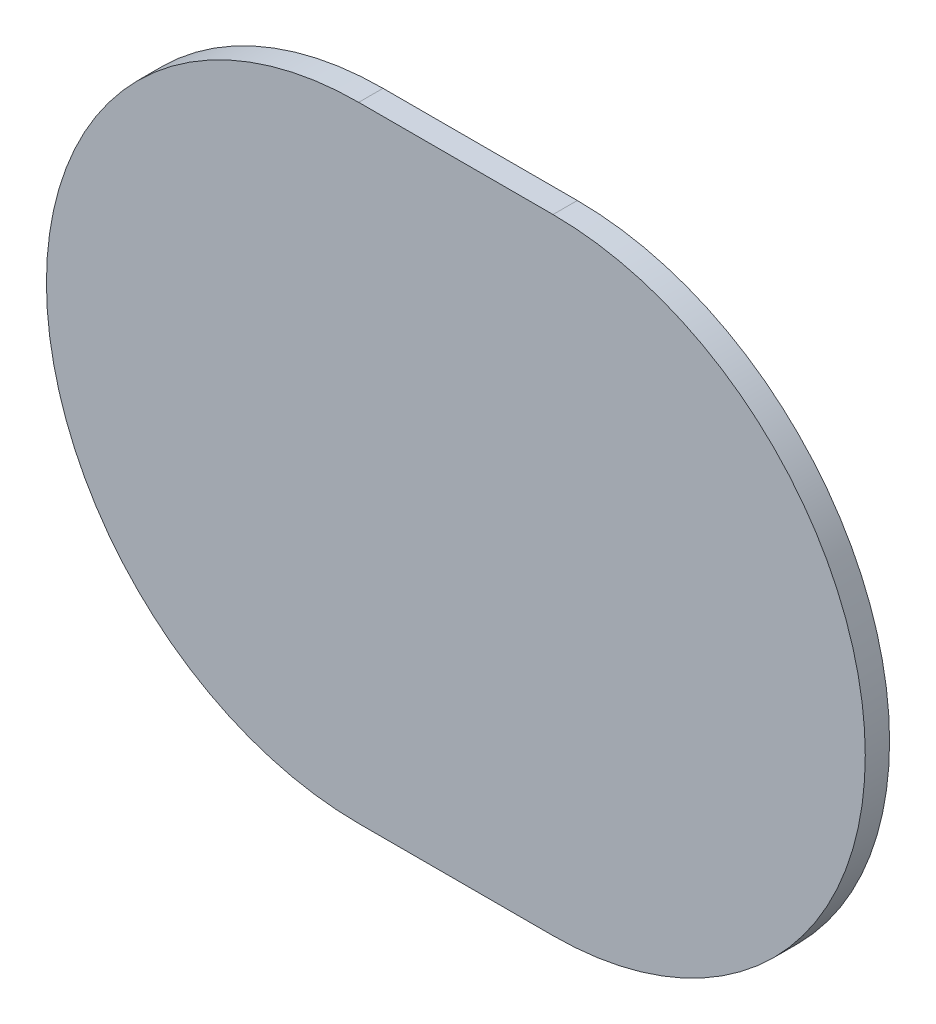
ISO-10303-21;
HEADER;
FILE_DESCRIPTION(('STEP AP214'),'2;1');
FILE_NAME('part.step','',(''),(''),'','','');
FILE_SCHEMA(('AUTOMOTIVE_DESIGN { 1 0 10303 214 1 1 1 1 }'));
ENDSEC;
DATA;
#1=APPLICATION_CONTEXT('core data for automotive mechanical design processes');
#2=APPLICATION_PROTOCOL_DEFINITION('international standard','automotive_design',2000,#1);
#3=PRODUCT_CONTEXT('',#1,'mechanical');
#4=PRODUCT('Part','Part','',(#3));
#5=PRODUCT_RELATED_PRODUCT_CATEGORY('part','',(#4));
#6=PRODUCT_DEFINITION_FORMATION('','',#4);
#7=PRODUCT_DEFINITION_CONTEXT('part definition',#1,'design');
#8=PRODUCT_DEFINITION('design','',#6,#7);
#9=PRODUCT_DEFINITION_SHAPE('','',#8);
#10=(LENGTH_UNIT() NAMED_UNIT(*) SI_UNIT(.MILLI.,.METRE.));
#11=(NAMED_UNIT(*) PLANE_ANGLE_UNIT() SI_UNIT($,.RADIAN.));
#12=(NAMED_UNIT(*) SI_UNIT($,.STERADIAN.) SOLID_ANGLE_UNIT());
#13=UNCERTAINTY_MEASURE_WITH_UNIT(LENGTH_MEASURE(1.E-05),#10,'distance_accuracy_value','');
#14=(GEOMETRIC_REPRESENTATION_CONTEXT(3) GLOBAL_UNCERTAINTY_ASSIGNED_CONTEXT((#13)) GLOBAL_UNIT_ASSIGNED_CONTEXT((#10,
#11,#12)) REPRESENTATION_CONTEXT('',''));
#15=CARTESIAN_POINT('',(0.,0.,0.));
#16=DIRECTION('',(0.,0.,1.));
#17=DIRECTION('',(1.,0.,0.));
#18=AXIS2_PLACEMENT_3D('',#15,#16,#17);
#19=CARTESIAN_POINT('',(139.79,-116.99,1.635));
#20=DIRECTION('',(0.,0.,1.));
#21=DIRECTION('',(1.,0.,0.));
#22=AXIS2_PLACEMENT_3D('',#19,#20,#21);
#23=PLANE('',#22);
#24=DIRECTION('',(1.,0.,0.));
#25=VECTOR('',#24,1.);
#26=CARTESIAN_POINT('',(139.79,-116.99,1.635));
#27=LINE('',#26,#25);
#28=CARTESIAN_POINT('',(139.79,-116.99,1.635));
#29=VERTEX_POINT('',#28);
#30=CARTESIAN_POINT('',(140.07,-116.99,1.635));
#31=VERTEX_POINT('',#30);
#32=EDGE_CURVE('E90',#29,#31,#27,.T.);
#33=ORIENTED_EDGE('',*,*,#32,.T.);
#34=CARTESIAN_POINT('',(140.07,-116.54,1.635));
#35=DIRECTION('',(0.,0.,1.));
#36=DIRECTION('',(0.,-1.,0.));
#37=AXIS2_PLACEMENT_3D('',#34,#35,#36);
#38=CIRCLE('',#37,0.45);
#39=CARTESIAN_POINT('',(140.07,-116.09,1.635));
#40=VERTEX_POINT('',#39);
#41=EDGE_CURVE('E85',#31,#40,#38,.T.);
#42=ORIENTED_EDGE('',*,*,#41,.T.);
#43=DIRECTION('',(-1.,0.,0.));
#44=VECTOR('',#43,1.);
#45=CARTESIAN_POINT('',(140.07,-116.09,1.635));
#46=LINE('',#45,#44);
#47=CARTESIAN_POINT('',(139.79,-116.09,1.635));
#48=VERTEX_POINT('',#47);
#49=EDGE_CURVE('E110',#40,#48,#46,.T.);
#50=ORIENTED_EDGE('',*,*,#49,.T.);
#51=CARTESIAN_POINT('',(139.79,-116.54,1.635));
#52=DIRECTION('',(0.,0.,1.));
#53=DIRECTION('',(0.,1.,0.));
#54=AXIS2_PLACEMENT_3D('',#51,#52,#53);
#55=CIRCLE('',#54,0.45);
#56=EDGE_CURVE('E11',#48,#29,#55,.T.);
#57=ORIENTED_EDGE('',*,*,#56,.T.);
#58=EDGE_LOOP('',(#33,#42,#50,#57));
#59=FACE_BOUND('',#58,.T.);
#60=ADVANCED_FACE('F17',(#59),#23,.T.);
#61=CARTESIAN_POINT('',(139.79,-116.99,1.6));
#62=DIRECTION('',(0.,0.,1.));
#63=DIRECTION('',(1.,0.,0.));
#64=AXIS2_PLACEMENT_3D('',#61,#62,#63);
#65=PLANE('',#64);
#66=CARTESIAN_POINT('',(139.79,-116.54,1.6));
#67=DIRECTION('',(0.,0.,1.));
#68=DIRECTION('',(0.,1.,0.));
#69=AXIS2_PLACEMENT_3D('',#66,#67,#68);
#70=CIRCLE('',#69,0.45);
#71=CARTESIAN_POINT('',(139.79,-116.09,1.6));
#72=VERTEX_POINT('',#71);
#73=CARTESIAN_POINT('',(139.79,-116.99,1.6));
#74=VERTEX_POINT('',#73);
#75=EDGE_CURVE('E20',#72,#74,#70,.T.);
#76=ORIENTED_EDGE('',*,*,#75,.F.);
#77=DIRECTION('',(-1.,0.,0.));
#78=VECTOR('',#77,1.);
#79=CARTESIAN_POINT('',(140.07,-116.09,1.6));
#80=LINE('',#79,#78);
#81=CARTESIAN_POINT('',(140.07,-116.09,1.6));
#82=VERTEX_POINT('',#81);
#83=EDGE_CURVE('E73',#82,#72,#80,.T.);
#84=ORIENTED_EDGE('',*,*,#83,.F.);
#85=CARTESIAN_POINT('',(140.07,-116.54,1.6));
#86=DIRECTION('',(0.,0.,1.));
#87=DIRECTION('',(0.,-1.,0.));
#88=AXIS2_PLACEMENT_3D('',#85,#86,#87);
#89=CIRCLE('',#88,0.45);
#90=CARTESIAN_POINT('',(140.07,-116.99,1.6));
#91=VERTEX_POINT('',#90);
#92=EDGE_CURVE('E67',#91,#82,#89,.T.);
#93=ORIENTED_EDGE('',*,*,#92,.F.);
#94=DIRECTION('',(1.,0.,0.));
#95=VECTOR('',#94,1.);
#96=CARTESIAN_POINT('',(139.79,-116.99,1.6));
#97=LINE('',#96,#95);
#98=EDGE_CURVE('E71',#74,#91,#97,.T.);
#99=ORIENTED_EDGE('',*,*,#98,.F.);
#100=EDGE_LOOP('',(#76,#84,#93,#99));
#101=FACE_BOUND('',#100,.T.);
#102=ADVANCED_FACE('F69',(#101),#65,.F.);
#103=CARTESIAN_POINT('',(139.79,-116.54,1.6));
#104=DIRECTION('',(0.,0.,-1.));
#105=DIRECTION('',(0.,1.,0.));
#106=AXIS2_PLACEMENT_3D('',#103,#104,#105);
#107=CYLINDRICAL_SURFACE('',#106,0.45);
#108=ORIENTED_EDGE('',*,*,#75,.T.);
#109=DIRECTION('',(0.,0.,1.));
#110=VECTOR('',#109,1.);
#111=CARTESIAN_POINT('',(139.79,-116.99,1.6));
#112=LINE('',#111,#110);
#113=EDGE_CURVE('E79',#74,#29,#112,.T.);
#114=ORIENTED_EDGE('',*,*,#113,.T.);
#115=ORIENTED_EDGE('',*,*,#56,.F.);
#116=DIRECTION('',(0.,0.,1.));
#117=VECTOR('',#116,1.);
#118=CARTESIAN_POINT('',(139.79,-116.09,1.6));
#119=LINE('',#118,#117);
#120=EDGE_CURVE('E109',#72,#48,#119,.T.);
#121=ORIENTED_EDGE('',*,*,#120,.F.);
#122=EDGE_LOOP('',(#108,#114,#115,#121));
#123=FACE_BOUND('',#122,.T.);
#124=ADVANCED_FACE('F119',(#123),#107,.T.);
#125=CARTESIAN_POINT('',(140.07,-116.09,1.6));
#126=DIRECTION('',(0.,-1.,0.));
#127=DIRECTION('',(0.,0.,-1.));
#128=AXIS2_PLACEMENT_3D('',#125,#126,#127);
#129=PLANE('',#128);
#130=ORIENTED_EDGE('',*,*,#83,.T.);
#131=ORIENTED_EDGE('',*,*,#120,.T.);
#132=ORIENTED_EDGE('',*,*,#49,.F.);
#133=DIRECTION('',(0.,0.,1.));
#134=VECTOR('',#133,1.);
#135=CARTESIAN_POINT('',(140.07,-116.09,1.6));
#136=LINE('',#135,#134);
#137=EDGE_CURVE('E78',#82,#40,#136,.T.);
#138=ORIENTED_EDGE('',*,*,#137,.F.);
#139=EDGE_LOOP('',(#130,#131,#132,#138));
#140=FACE_BOUND('',#139,.T.);
#141=ADVANCED_FACE('F118',(#140),#129,.F.);
#142=CARTESIAN_POINT('',(140.07,-116.54,1.6));
#143=DIRECTION('',(0.,0.,-1.));
#144=DIRECTION('',(0.,-1.,0.));
#145=AXIS2_PLACEMENT_3D('',#142,#143,#144);
#146=CYLINDRICAL_SURFACE('',#145,0.45);
#147=ORIENTED_EDGE('',*,*,#92,.T.);
#148=ORIENTED_EDGE('',*,*,#137,.T.);
#149=ORIENTED_EDGE('',*,*,#41,.F.);
#150=DIRECTION('',(0.,0.,1.));
#151=VECTOR('',#150,1.);
#152=CARTESIAN_POINT('',(140.07,-116.99,1.6));
#153=LINE('',#152,#151);
#154=EDGE_CURVE('E82',#91,#31,#153,.T.);
#155=ORIENTED_EDGE('',*,*,#154,.F.);
#156=EDGE_LOOP('',(#147,#148,#149,#155));
#157=FACE_BOUND('',#156,.T.);
#158=ADVANCED_FACE('F83',(#157),#146,.T.);
#159=CARTESIAN_POINT('',(139.79,-116.99,1.6));
#160=DIRECTION('',(0.,1.,0.));
#161=DIRECTION('',(1.,0.,0.));
#162=AXIS2_PLACEMENT_3D('',#159,#160,#161);
#163=PLANE('',#162);
#164=ORIENTED_EDGE('',*,*,#98,.T.);
#165=ORIENTED_EDGE('',*,*,#154,.T.);
#166=ORIENTED_EDGE('',*,*,#32,.F.);
#167=ORIENTED_EDGE('',*,*,#113,.F.);
#168=EDGE_LOOP('',(#164,#165,#166,#167));
#169=FACE_BOUND('',#168,.T.);
#170=ADVANCED_FACE('F93',(#169),#163,.F.);
#171=CLOSED_SHELL('',(#60,#102,#124,#141,#158,#170));
#172=MANIFOLD_SOLID_BREP('B1',#171);
#173=ADVANCED_BREP_SHAPE_REPRESENTATION('',(#18,#172),#14);
#174=SHAPE_DEFINITION_REPRESENTATION(#9,#173);
ENDSEC;
END-ISO-10303-21;
